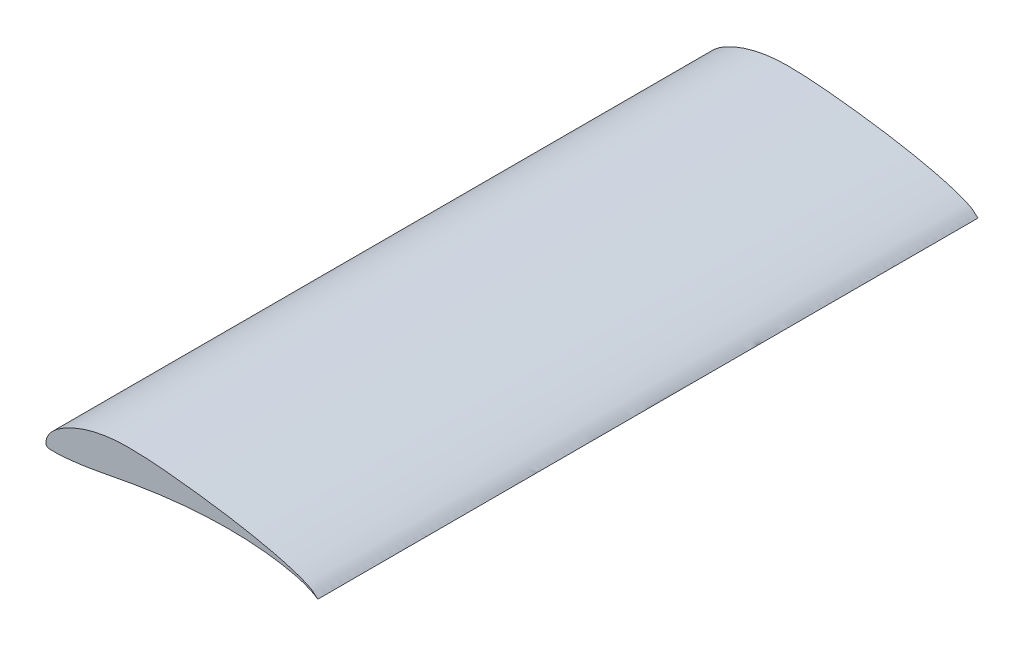
ISO-10303-21;
HEADER;
FILE_DESCRIPTION(('STEP AP214'),'2;1');
FILE_NAME('part.step','',(''),(''),'','','');
FILE_SCHEMA(('AUTOMOTIVE_DESIGN { 1 0 10303 214 1 1 1 1 }'));
ENDSEC;
DATA;
#1=APPLICATION_CONTEXT('core data for automotive mechanical design processes');
#2=APPLICATION_PROTOCOL_DEFINITION('international standard','automotive_design',2000,#1);
#3=PRODUCT_CONTEXT('',#1,'mechanical');
#4=PRODUCT('Part','Part','',(#3));
#5=PRODUCT_RELATED_PRODUCT_CATEGORY('part','',(#4));
#6=PRODUCT_DEFINITION_FORMATION('','',#4);
#7=PRODUCT_DEFINITION_CONTEXT('part definition',#1,'design');
#8=PRODUCT_DEFINITION('design','',#6,#7);
#9=PRODUCT_DEFINITION_SHAPE('','',#8);
#10=(LENGTH_UNIT() NAMED_UNIT(*) SI_UNIT(.MILLI.,.METRE.));
#11=(NAMED_UNIT(*) PLANE_ANGLE_UNIT() SI_UNIT($,.RADIAN.));
#12=(NAMED_UNIT(*) SI_UNIT($,.STERADIAN.) SOLID_ANGLE_UNIT());
#13=UNCERTAINTY_MEASURE_WITH_UNIT(LENGTH_MEASURE(1.E-05),#10,'distance_accuracy_value','');
#14=(GEOMETRIC_REPRESENTATION_CONTEXT(3) GLOBAL_UNCERTAINTY_ASSIGNED_CONTEXT((#13)) GLOBAL_UNIT_ASSIGNED_CONTEXT((#10,
#11,#12)) REPRESENTATION_CONTEXT('',''));
#15=CARTESIAN_POINT('',(0.,0.,0.));
#16=DIRECTION('',(0.,0.,1.));
#17=DIRECTION('',(1.,0.,0.));
#18=AXIS2_PLACEMENT_3D('',#15,#16,#17);
#19=CARTESIAN_POINT('',(177.8,0.,431.8));
#20=CARTESIAN_POINT('',(177.801065159161,0.00452602580546919,431.8));
#21=CARTESIAN_POINT('',(177.216655268838,0.440103725635142,431.8));
#22=CARTESIAN_POINT('',(176.722426294015,0.925190769175631,431.8));
#23=CARTESIAN_POINT('',(175.625027607352,1.93840151263958,431.8));
#24=CARTESIAN_POINT('',(174.330334023038,3.01628535676229,431.8));
#25=CARTESIAN_POINT('',(172.559239339063,4.10299038107703,431.8));
#26=CARTESIAN_POINT('',(170.356819614942,5.15621195933377,431.8));
#27=CARTESIAN_POINT('',(167.697951773968,6.25543671873728,431.8));
#28=CARTESIAN_POINT('',(164.586686424987,7.38536450532403,431.8));
#29=CARTESIAN_POINT('',(161.037538095144,8.53801447071404,431.8));
#30=CARTESIAN_POINT('',(157.068930976921,9.70338094508955,431.8));
#31=CARTESIAN_POINT('',(152.703088340985,10.875993654472,431.8));
#32=CARTESIAN_POINT('',(147.964115763954,12.0450884562191,431.8));
#33=CARTESIAN_POINT('',(142.879182717218,13.2022035264838,431.8));
#34=CARTESIAN_POINT('',(137.478596599803,14.3401117761136,431.8));
#35=CARTESIAN_POINT('',(131.795336079767,15.4529626119385,431.8));
#36=CARTESIAN_POINT('',(125.862616057575,16.5270679094599,431.8));
#37=CARTESIAN_POINT('',(119.717796863325,17.5608882329923,431.8));
#38=CARTESIAN_POINT('',(113.396290346779,18.5411184937892,431.8));
#39=CARTESIAN_POINT('',(106.938979237697,19.4696638515981,431.8));
#40=CARTESIAN_POINT('',(100.387246956482,20.3391676900212,431.8));
#41=CARTESIAN_POINT('',(93.7885483195373,21.1468431993319,431.8));
#42=CARTESIAN_POINT('',(87.1956369575885,21.8983924676009,431.8));
#43=CARTESIAN_POINT('',(80.663090222315,22.5748707224764,431.8));
#44=CARTESIAN_POINT('',(74.2441265738798,23.1636284905327,431.8));
#45=CARTESIAN_POINT('',(67.9838868993611,23.63158032071,431.8));
#46=CARTESIAN_POINT('',(61.9181282466395,23.9537663738993,431.8));
#47=CARTESIAN_POINT('',(56.0805905485763,24.0934413255032,431.8));
#48=CARTESIAN_POINT('',(50.5011836686953,24.0796143517338,431.8));
#49=CARTESIAN_POINT('',(45.1902977415211,23.807321577058,431.8));
#50=CARTESIAN_POINT('',(40.1458718027415,23.2545730604643,431.8));
#51=CARTESIAN_POINT('',(35.3473800950246,22.4725867400226,431.8));
#52=CARTESIAN_POINT('',(30.7936641755689,21.4592513602432,431.8));
#53=CARTESIAN_POINT('',(26.4894115848662,20.2708004947052,431.8));
#54=CARTESIAN_POINT('',(22.4528368374286,18.9282931638771,431.8));
#55=CARTESIAN_POINT('',(18.7011114256234,17.4631369084619,431.8));
#56=CARTESIAN_POINT('',(15.2575487999067,15.8831809582558,431.8));
#57=CARTESIAN_POINT('',(12.1331968361778,14.2205128422478,431.8));
#58=CARTESIAN_POINT('',(9.34505469113197,12.4940434182527,431.8));
#59=CARTESIAN_POINT('',(6.91060920195594,10.7271712499322,431.8));
#60=CARTESIAN_POINT('',(4.83087098201426,8.95735582043007,431.8));
#61=CARTESIAN_POINT('',(3.13599233956045,7.16526939519639,431.8));
#62=CARTESIAN_POINT('',(1.83403849586166,5.36643259076119,431.8));
#63=CARTESIAN_POINT('',(0.872247282771678,3.61635278833854,431.8));
#64=CARTESIAN_POINT('',(0.255750277235631,1.95468514829911,431.8));
#65=CARTESIAN_POINT('',(-0.0381350827319731,0.420920249493625,431.8));
#66=CARTESIAN_POINT('',(0.0183253818803724,-0.87633249494563,431.8));
#67=CARTESIAN_POINT('',(0.352106060870116,-2.06616961552951,431.8));
#68=CARTESIAN_POINT('',(1.59346531332557,-2.65699397970321,431.8));
#69=CARTESIAN_POINT('',(3.26260847499286,-2.7401356410188,431.8));
#70=CARTESIAN_POINT('',(5.54599564212614,-2.82082856410901,431.8));
#71=CARTESIAN_POINT('',(8.41755388211667,-2.69748369342326,431.8));
#72=CARTESIAN_POINT('',(11.8448123006329,-2.47050300856655,431.8));
#73=CARTESIAN_POINT('',(15.7896350867487,-2.10666993105551,431.8));
#74=CARTESIAN_POINT('',(20.211655011826,-1.61423451051039,431.8));
#75=CARTESIAN_POINT('',(25.0893113241349,-0.982610430517202,431.8));
#76=CARTESIAN_POINT('',(30.4202392685999,-0.0995723857697159,431.8));
#77=CARTESIAN_POINT('',(36.2303894255846,1.00788979428696,431.8));
#78=CARTESIAN_POINT('',(42.5487864596981,2.21316286926951,431.8));
#79=CARTESIAN_POINT('',(49.3445424307847,3.48573756009015,431.8));
#80=CARTESIAN_POINT('',(56.5749653151144,4.77275318489136,431.8));
#81=CARTESIAN_POINT('',(64.1869481032107,6.02587293481171,431.8));
#82=CARTESIAN_POINT('',(72.1214311078162,7.20321911964711,431.8));
#83=CARTESIAN_POINT('',(80.3100297692003,8.26156507978366,431.8));
#84=CARTESIAN_POINT('',(88.6791027339349,9.17006668217214,431.8));
#85=CARTESIAN_POINT('',(97.1495878506493,9.8878885023522,431.8));
#86=CARTESIAN_POINT('',(105.63647978263,10.396319112261,431.8));
#87=CARTESIAN_POINT('',(114.051109803837,10.6752024990515,431.8));
#88=CARTESIAN_POINT('',(122.302191882052,10.7092212541319,431.8));
#89=CARTESIAN_POINT('',(130.297671936653,10.4959853344457,431.8));
#90=CARTESIAN_POINT('',(137.945997409662,10.0404705885101,431.8));
#91=CARTESIAN_POINT('',(145.155198337122,9.34855325655363,431.8));
#92=CARTESIAN_POINT('',(151.83944793456,8.44676047424715,431.8));
#93=CARTESIAN_POINT('',(157.911721830328,7.36124092620892,431.8));
#94=CARTESIAN_POINT('',(163.300829262982,6.12832782752346,431.8));
#95=CARTESIAN_POINT('',(167.907457919654,4.80925053057484,431.8));
#96=CARTESIAN_POINT('',(171.677453337855,3.40160976589918,431.8));
#97=CARTESIAN_POINT('',(174.367200412915,2.11356583044849,431.8));
#98=CARTESIAN_POINT('',(176.350238645095,0.922681714964892,431.8));
#99=CARTESIAN_POINT('',(177.112036095642,0.461830148240402,431.8));
#100=CARTESIAN_POINT('',(177.798913186249,-0.00461803950089545,431.8));
#101=CARTESIAN_POINT('',(177.8,0.,431.8));
#102=B_SPLINE_CURVE_WITH_KNOTS('',3,(#19,#20,#21,#22,#23,#24,#25,#26,#27,#28,#29,#30,#31,#32,
#33,#34,#35,#36,#37,#38,#39,#40,#41,#42,#43,#44,#45,#46,#47,#48,#49,#50,#51,#52,#53,#54,#55,#56,
#57,#58,#59,#60,#61,#62,#63,#64,#65,#66,#67,#68,#69,#70,#71,#72,#73,#74,#75,#76,#77,#78,#79,#80,
#81,#82,#83,#84,#85,#86,#87,#88,#89,#90,#91,#92,#93,#94,#95,#96,#97,#98,#99,#100,#101),
.UNSPECIFIED.,.T.,.F.,(4,1,1,1,1,1,1,1,1,1,1,1,1,1,1,1,1,1,1,1,1,1,1,1,1,1,1,1,1,1,1,1,1,1,1,1,
1,1,1,1,1,1,1,1,1,1,1,1,1,1,1,1,1,1,1,1,1,1,1,1,1,1,1,1,1,1,1,1,1,1,1,1,1,1,1,1,1,1,1,1,4),(0.,
0.000979677557134158,0.00364886216776312,0.00748349851947815,0.0120952771855934,
0.0175255907768788,0.0240517799938711,0.0317830505527587,0.0406778280832618,0.050710300790478,
0.0618332290621795,0.0739892504845854,0.0871181731906812,0.101145048769791,0.115990637111827,
0.131570421640589,0.147788379302961,0.164550916882416,0.181757895150531,0.199311954944345,
0.217095071712264,0.234990228463986,0.252856883122009,0.270540593729572,0.287886779266045,
0.304773437599674,0.321101419214061,0.336806063174811,0.351800032584037,0.366031063392082,
0.379615674919835,0.392652962879186,0.405170358707495,0.417171919049936,0.428603516911185,
0.439418959108259,0.449596586064162,0.459102079103161,0.467907877534646,0.475988300736527,
0.483308968746149,0.489874507816402,0.495803249719207,0.501149411695553,0.50590307325604,
0.510046768536663,0.513579310681042,0.516446926626751,0.5193500525909,0.523823355179486,
0.529973793997694,0.537715654387927,0.546967844488146,0.55763736682571,0.569620481096633,
0.582804124215616,0.597246960791632,0.613135036654701,0.630443600329816,0.649056123608545,
0.668822256795696,0.689594964002684,0.711189650864602,0.733426688964389,0.756094117504156,
0.778988553684861,0.801889682684954,0.824566597829707,0.846792284880411,0.868338290507787,
0.888978162959066,0.908492011340558,0.926658767581933,0.943286193042322,0.958169210358795,
0.971135821634751,0.981955623079976,0.990251791025976,0.995852565249962,0.999000405686701,1.),.UNSPECIFIED.);
#103=DIRECTION('',(0.,0.,-1.));
#104=VECTOR('',#103,1.);
#105=SURFACE_OF_LINEAR_EXTRUSION('',#102,#104);
#106=CARTESIAN_POINT('',(177.8,0.,431.8));
#107=VERTEX_POINT('',#106);
#108=EDGE_CURVE('E10',#107,#107,#102,.T.);
#109=ORIENTED_EDGE('',*,*,#108,.F.);
#110=EDGE_LOOP('',(#109));
#111=FACE_BOUND('',#110,.T.);
#112=CARTESIAN_POINT('',(177.8,0.,0.));
#113=CARTESIAN_POINT('',(177.801065159161,0.00452602580546919,0.));
#114=CARTESIAN_POINT('',(177.216655268838,0.440103725635142,0.));
#115=CARTESIAN_POINT('',(176.722426294015,0.925190769175631,0.));
#116=CARTESIAN_POINT('',(175.625027607352,1.93840151263958,0.));
#117=CARTESIAN_POINT('',(174.330334023038,3.01628535676229,0.));
#118=CARTESIAN_POINT('',(172.559239339063,4.10299038107703,0.));
#119=CARTESIAN_POINT('',(170.356819614942,5.15621195933377,0.));
#120=CARTESIAN_POINT('',(167.697951773968,6.25543671873728,0.));
#121=CARTESIAN_POINT('',(164.586686424987,7.38536450532403,0.));
#122=CARTESIAN_POINT('',(161.037538095144,8.53801447071404,0.));
#123=CARTESIAN_POINT('',(157.068930976921,9.70338094508955,0.));
#124=CARTESIAN_POINT('',(152.703088340985,10.875993654472,0.));
#125=CARTESIAN_POINT('',(147.964115763954,12.0450884562191,0.));
#126=CARTESIAN_POINT('',(142.879182717218,13.2022035264838,0.));
#127=CARTESIAN_POINT('',(137.478596599803,14.3401117761136,0.));
#128=CARTESIAN_POINT('',(131.795336079767,15.4529626119385,0.));
#129=CARTESIAN_POINT('',(125.862616057575,16.5270679094599,0.));
#130=CARTESIAN_POINT('',(119.717796863325,17.5608882329923,0.));
#131=CARTESIAN_POINT('',(113.396290346779,18.5411184937892,0.));
#132=CARTESIAN_POINT('',(106.938979237697,19.4696638515981,0.));
#133=CARTESIAN_POINT('',(100.387246956482,20.3391676900212,0.));
#134=CARTESIAN_POINT('',(93.7885483195373,21.1468431993319,0.));
#135=CARTESIAN_POINT('',(87.1956369575885,21.8983924676009,0.));
#136=CARTESIAN_POINT('',(80.663090222315,22.5748707224764,0.));
#137=CARTESIAN_POINT('',(74.2441265738798,23.1636284905327,0.));
#138=CARTESIAN_POINT('',(67.9838868993611,23.63158032071,0.));
#139=CARTESIAN_POINT('',(61.9181282466395,23.9537663738993,0.));
#140=CARTESIAN_POINT('',(56.0805905485763,24.0934413255032,0.));
#141=CARTESIAN_POINT('',(50.5011836686953,24.0796143517338,0.));
#142=CARTESIAN_POINT('',(45.1902977415211,23.807321577058,0.));
#143=CARTESIAN_POINT('',(40.1458718027415,23.2545730604643,0.));
#144=CARTESIAN_POINT('',(35.3473800950246,22.4725867400226,0.));
#145=CARTESIAN_POINT('',(30.7936641755689,21.4592513602432,0.));
#146=CARTESIAN_POINT('',(26.4894115848662,20.2708004947052,0.));
#147=CARTESIAN_POINT('',(22.4528368374286,18.9282931638771,0.));
#148=CARTESIAN_POINT('',(18.7011114256234,17.4631369084619,0.));
#149=CARTESIAN_POINT('',(15.2575487999067,15.8831809582558,0.));
#150=CARTESIAN_POINT('',(12.1331968361778,14.2205128422478,0.));
#151=CARTESIAN_POINT('',(9.34505469113197,12.4940434182527,0.));
#152=CARTESIAN_POINT('',(6.91060920195594,10.7271712499322,0.));
#153=CARTESIAN_POINT('',(4.83087098201426,8.95735582043007,0.));
#154=CARTESIAN_POINT('',(3.13599233956045,7.16526939519639,0.));
#155=CARTESIAN_POINT('',(1.83403849586166,5.36643259076119,0.));
#156=CARTESIAN_POINT('',(0.872247282771678,3.61635278833854,0.));
#157=CARTESIAN_POINT('',(0.255750277235631,1.95468514829911,0.));
#158=CARTESIAN_POINT('',(-0.0381350827319731,0.420920249493625,0.));
#159=CARTESIAN_POINT('',(0.0183253818803724,-0.87633249494563,0.));
#160=CARTESIAN_POINT('',(0.352106060870116,-2.06616961552951,0.));
#161=CARTESIAN_POINT('',(1.59346531332557,-2.65699397970321,0.));
#162=CARTESIAN_POINT('',(3.26260847499286,-2.7401356410188,0.));
#163=CARTESIAN_POINT('',(5.54599564212614,-2.82082856410901,0.));
#164=CARTESIAN_POINT('',(8.41755388211667,-2.69748369342326,0.));
#165=CARTESIAN_POINT('',(11.8448123006329,-2.47050300856655,0.));
#166=CARTESIAN_POINT('',(15.7896350867487,-2.10666993105551,0.));
#167=CARTESIAN_POINT('',(20.211655011826,-1.61423451051039,0.));
#168=CARTESIAN_POINT('',(25.0893113241349,-0.982610430517202,0.));
#169=CARTESIAN_POINT('',(30.4202392685999,-0.0995723857697159,0.));
#170=CARTESIAN_POINT('',(36.2303894255846,1.00788979428696,0.));
#171=CARTESIAN_POINT('',(42.5487864596981,2.21316286926951,0.));
#172=CARTESIAN_POINT('',(49.3445424307847,3.48573756009015,0.));
#173=CARTESIAN_POINT('',(56.5749653151144,4.77275318489136,0.));
#174=CARTESIAN_POINT('',(64.1869481032107,6.02587293481171,0.));
#175=CARTESIAN_POINT('',(72.1214311078162,7.20321911964711,0.));
#176=CARTESIAN_POINT('',(80.3100297692003,8.26156507978366,0.));
#177=CARTESIAN_POINT('',(88.6791027339349,9.17006668217214,0.));
#178=CARTESIAN_POINT('',(97.1495878506493,9.8878885023522,0.));
#179=CARTESIAN_POINT('',(105.63647978263,10.396319112261,0.));
#180=CARTESIAN_POINT('',(114.051109803837,10.6752024990515,0.));
#181=CARTESIAN_POINT('',(122.302191882052,10.7092212541319,0.));
#182=CARTESIAN_POINT('',(130.297671936653,10.4959853344457,0.));
#183=CARTESIAN_POINT('',(137.945997409662,10.0404705885101,0.));
#184=CARTESIAN_POINT('',(145.155198337122,9.34855325655363,0.));
#185=CARTESIAN_POINT('',(151.83944793456,8.44676047424715,0.));
#186=CARTESIAN_POINT('',(157.911721830328,7.36124092620892,0.));
#187=CARTESIAN_POINT('',(163.300829262982,6.12832782752346,0.));
#188=CARTESIAN_POINT('',(167.907457919654,4.80925053057484,0.));
#189=CARTESIAN_POINT('',(171.677453337855,3.40160976589918,0.));
#190=CARTESIAN_POINT('',(174.367200412915,2.11356583044849,0.));
#191=CARTESIAN_POINT('',(176.350238645095,0.922681714964892,0.));
#192=CARTESIAN_POINT('',(177.112036095642,0.461830148240402,0.));
#193=CARTESIAN_POINT('',(177.798913186249,-0.00461803950089545,0.));
#194=CARTESIAN_POINT('',(177.8,0.,0.));
#195=B_SPLINE_CURVE_WITH_KNOTS('',3,(#112,#113,#114,#115,#116,#117,#118,#119,#120,#121,#122,
#123,#124,#125,#126,#127,#128,#129,#130,#131,#132,#133,#134,#135,#136,#137,#138,#139,#140,#141,
#142,#143,#144,#145,#146,#147,#148,#149,#150,#151,#152,#153,#154,#155,#156,#157,#158,#159,#160,
#161,#162,#163,#164,#165,#166,#167,#168,#169,#170,#171,#172,#173,#174,#175,#176,#177,#178,#179,
#180,#181,#182,#183,#184,#185,#186,#187,#188,#189,#190,#191,#192,#193,#194),.UNSPECIFIED.,.T.,
.F.,(4,1,1,1,1,1,1,1,1,1,1,1,1,1,1,1,1,1,1,1,1,1,1,1,1,1,1,1,1,1,1,1,1,1,1,1,1,1,1,1,1,1,1,1,1,
1,1,1,1,1,1,1,1,1,1,1,1,1,1,1,1,1,1,1,1,1,1,1,1,1,1,1,1,1,1,1,1,1,1,1,4),(0.,
0.000979677557134158,0.00364886216776312,0.00748349851947815,0.0120952771855934,
0.0175255907768788,0.0240517799938711,0.0317830505527587,0.0406778280832618,0.050710300790478,
0.0618332290621795,0.0739892504845854,0.0871181731906812,0.101145048769791,0.115990637111827,
0.131570421640589,0.147788379302961,0.164550916882416,0.181757895150531,0.199311954944345,
0.217095071712264,0.234990228463986,0.252856883122009,0.270540593729572,0.287886779266045,
0.304773437599674,0.321101419214061,0.336806063174811,0.351800032584037,0.366031063392082,
0.379615674919835,0.392652962879186,0.405170358707495,0.417171919049936,0.428603516911185,
0.439418959108259,0.449596586064162,0.459102079103161,0.467907877534646,0.475988300736527,
0.483308968746149,0.489874507816402,0.495803249719207,0.501149411695553,0.50590307325604,
0.510046768536663,0.513579310681042,0.516446926626751,0.5193500525909,0.523823355179486,
0.529973793997694,0.537715654387927,0.546967844488146,0.55763736682571,0.569620481096633,
0.582804124215616,0.597246960791632,0.613135036654701,0.630443600329816,0.649056123608545,
0.668822256795696,0.689594964002684,0.711189650864602,0.733426688964389,0.756094117504156,
0.778988553684861,0.801889682684954,0.824566597829707,0.846792284880411,0.868338290507787,
0.888978162959066,0.908492011340558,0.926658767581933,0.943286193042322,0.958169210358795,
0.971135821634751,0.981955623079976,0.990251791025976,0.995852565249962,0.999000405686701,1.),.UNSPECIFIED.);
#196=CARTESIAN_POINT('',(177.8,0.,0.));
#197=VERTEX_POINT('',#196);
#198=EDGE_CURVE('E34',#197,#197,#195,.T.);
#199=ORIENTED_EDGE('',*,*,#198,.T.);
#200=EDGE_LOOP('',(#199));
#201=FACE_BOUND('',#200,.T.);
#202=ADVANCED_FACE('F30',(#111,#201),#105,.F.);
#203=CARTESIAN_POINT('',(1.06682357509064,3.91771130008587,431.8));
#204=DIRECTION('',(0.,0.,-1.));
#205=DIRECTION('',(-1.,0.,0.));
#206=AXIS2_PLACEMENT_3D('',#203,#204,#205);
#207=PLANE('',#206);
#208=ORIENTED_EDGE('',*,*,#108,.T.);
#209=EDGE_LOOP('',(#208));
#210=FACE_BOUND('',#209,.T.);
#211=ADVANCED_FACE('F53',(#210),#207,.F.);
#212=CARTESIAN_POINT('',(1.06682357509064,3.91771130008587,0.));
#213=DIRECTION('',(0.,0.,-1.));
#214=DIRECTION('',(-1.,0.,0.));
#215=AXIS2_PLACEMENT_3D('',#212,#213,#214);
#216=PLANE('',#215);
#217=ORIENTED_EDGE('',*,*,#198,.F.);
#218=EDGE_LOOP('',(#217));
#219=FACE_BOUND('',#218,.T.);
#220=ADVANCED_FACE('F51',(#219),#216,.T.);
#221=CLOSED_SHELL('',(#202,#211,#220));
#222=MANIFOLD_SOLID_BREP('B2',#221);
#223=ADVANCED_BREP_SHAPE_REPRESENTATION('',(#18,#222),#14);
#224=SHAPE_DEFINITION_REPRESENTATION(#9,#223);
ENDSEC;
END-ISO-10303-21;
